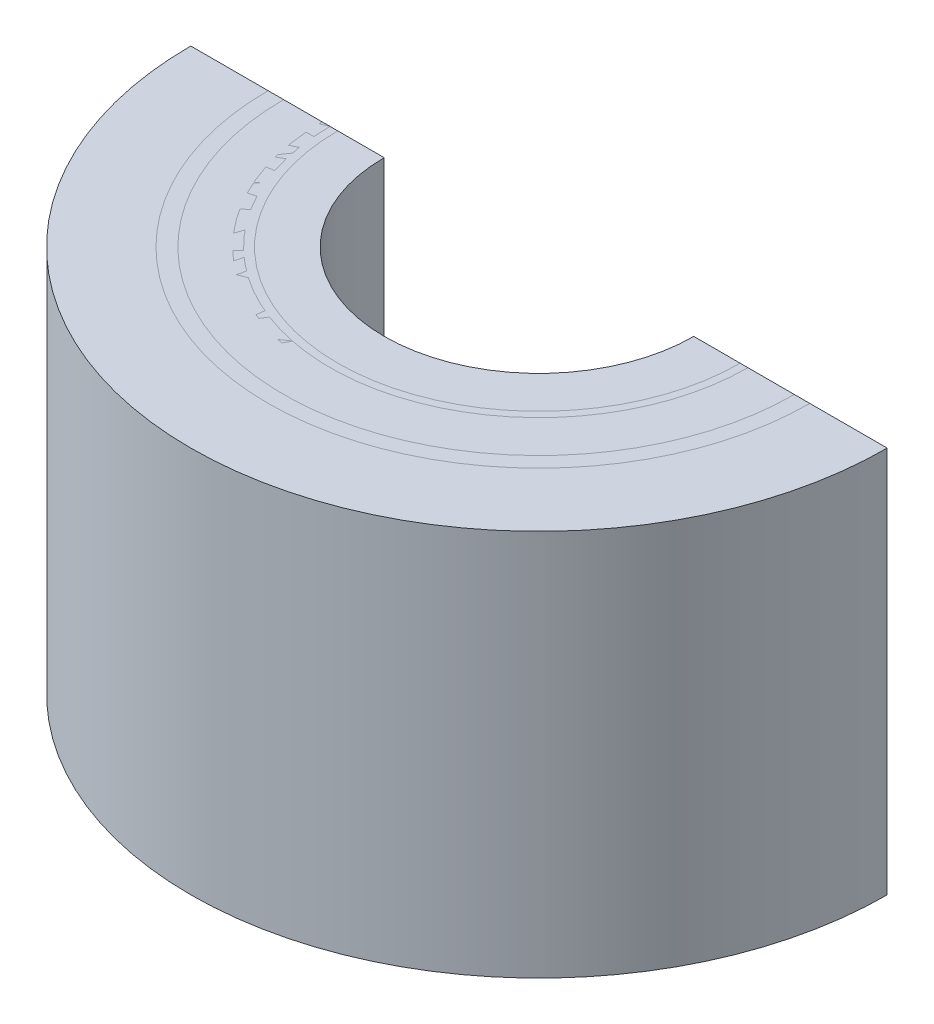
ISO-10303-21;
HEADER;
FILE_DESCRIPTION(('STEP AP214'),'2;1');
FILE_NAME('part.step','',(''),(''),'','','');
FILE_SCHEMA(('AUTOMOTIVE_DESIGN { 1 0 10303 214 1 1 1 1 }'));
ENDSEC;
DATA;
#1=APPLICATION_CONTEXT('core data for automotive mechanical design processes');
#2=APPLICATION_PROTOCOL_DEFINITION('international standard','automotive_design',2000,#1);
#3=PRODUCT_CONTEXT('',#1,'mechanical');
#4=PRODUCT('Part','Part','',(#3));
#5=PRODUCT_RELATED_PRODUCT_CATEGORY('part','',(#4));
#6=PRODUCT_DEFINITION_FORMATION('','',#4);
#7=PRODUCT_DEFINITION_CONTEXT('part definition',#1,'design');
#8=PRODUCT_DEFINITION('design','',#6,#7);
#9=PRODUCT_DEFINITION_SHAPE('','',#8);
#10=(LENGTH_UNIT() NAMED_UNIT(*) SI_UNIT(.MILLI.,.METRE.));
#11=(NAMED_UNIT(*) PLANE_ANGLE_UNIT() SI_UNIT($,.RADIAN.));
#12=(NAMED_UNIT(*) SI_UNIT($,.STERADIAN.) SOLID_ANGLE_UNIT());
#13=UNCERTAINTY_MEASURE_WITH_UNIT(LENGTH_MEASURE(1.E-05),#10,'distance_accuracy_value','');
#14=(GEOMETRIC_REPRESENTATION_CONTEXT(3) GLOBAL_UNCERTAINTY_ASSIGNED_CONTEXT((#13)) GLOBAL_UNIT_ASSIGNED_CONTEXT((#10,
#11,#12)) REPRESENTATION_CONTEXT('',''));
#15=CARTESIAN_POINT('',(0.,0.,0.));
#16=DIRECTION('',(0.,0.,1.));
#17=DIRECTION('',(1.,0.,0.));
#18=AXIS2_PLACEMENT_3D('',#15,#16,#17);
#19=CARTESIAN_POINT('',(-10.4075930728994,30.0600783028188,30.4966063293363));
#20=DIRECTION('',(0.,1.,0.));
#21=DIRECTION('',(0.,0.,1.));
#22=AXIS2_PLACEMENT_3D('',#19,#20,#21);
#23=PLANE('',#22);
#24=DIRECTION('',(1.,0.,0.));
#25=VECTOR('',#24,1.);
#26=CARTESIAN_POINT('',(-32.9075930728994,30.0600783028188,30.4966063293363));
#27=LINE('',#26,#25);
#28=CARTESIAN_POINT('',(-27.9075930728994,30.0600783028188,30.4966063293363));
#29=VERTEX_POINT('',#28);
#30=CARTESIAN_POINT('',(-26.9075930728994,30.0600783028188,30.4966063293363));
#31=VERTEX_POINT('',#30);
#32=EDGE_CURVE('E65',#29,#31,#27,.T.);
#33=ORIENTED_EDGE('',*,*,#32,.F.);
#34=CARTESIAN_POINT('',(-10.4075930728994,30.0600783028188,30.4966063293363));
#35=DIRECTION('',(0.,1.,0.));
#36=DIRECTION('',(0.,0.,1.));
#37=AXIS2_PLACEMENT_3D('',#34,#35,#36);
#38=CIRCLE('',#37,17.5);
#39=CARTESIAN_POINT('',(7.09240692710058,30.0600783028188,30.4966063293363));
#40=VERTEX_POINT('',#39);
#41=EDGE_CURVE('E95',#29,#40,#38,.T.);
#42=ORIENTED_EDGE('',*,*,#41,.T.);
#43=CARTESIAN_POINT('',(6.09240692710058,30.0600783028188,30.4966063293363));
#44=VERTEX_POINT('',#43);
#45=EDGE_CURVE('E98',#44,#40,#27,.T.);
#46=ORIENTED_EDGE('',*,*,#45,.F.);
#47=CARTESIAN_POINT('',(-10.4075930728994,30.0600783028188,30.4966063293363));
#48=DIRECTION('',(0.,1.,0.));
#49=DIRECTION('',(0.,0.,1.));
#50=AXIS2_PLACEMENT_3D('',#47,#48,#49);
#51=CIRCLE('',#50,16.5);
#52=EDGE_CURVE('E97',#31,#44,#51,.T.);
#53=ORIENTED_EDGE('',*,*,#52,.F.);
#54=EDGE_LOOP('',(#33,#42,#46,#53));
#55=FACE_BOUND('',#54,.T.);
#56=ADVANCED_FACE('F43',(#55),#23,.T.);
#57=CARTESIAN_POINT('',(-10.4075930728994,5.06007830281875,30.4966063293363));
#58=DIRECTION('',(0.,1.,0.));
#59=DIRECTION('',(0.,0.,1.));
#60=AXIS2_PLACEMENT_3D('',#57,#58,#59);
#61=PLANE('',#60);
#62=CARTESIAN_POINT('',(-10.4075930728994,5.06007830281875,30.4966063293363));
#63=DIRECTION('',(0.,1.,0.));
#64=DIRECTION('',(0.,0.,1.));
#65=AXIS2_PLACEMENT_3D('',#62,#63,#64);
#66=CIRCLE('',#65,17.5);
#67=CARTESIAN_POINT('',(-27.9075930728994,5.06007830281875,30.4966063293363));
#68=VERTEX_POINT('',#67);
#69=CARTESIAN_POINT('',(7.09240692710058,5.06007830281875,30.4966063293363));
#70=VERTEX_POINT('',#69);
#71=EDGE_CURVE('E102',#68,#70,#66,.T.);
#72=ORIENTED_EDGE('',*,*,#71,.F.);
#73=DIRECTION('',(1.,0.,0.));
#74=VECTOR('',#73,1.);
#75=CARTESIAN_POINT('',(-10.4075930728994,5.06007830281875,30.4966063293363));
#76=LINE('',#75,#74);
#77=CARTESIAN_POINT('',(-26.9075930728994,5.06007830281875,30.4966063293363));
#78=VERTEX_POINT('',#77);
#79=EDGE_CURVE('E84',#68,#78,#76,.T.);
#80=ORIENTED_EDGE('',*,*,#79,.T.);
#81=CARTESIAN_POINT('',(-10.4075930728994,5.06007830281875,30.4966063293363));
#82=DIRECTION('',(0.,1.,0.));
#83=DIRECTION('',(0.,0.,1.));
#84=AXIS2_PLACEMENT_3D('',#81,#82,#83);
#85=CIRCLE('',#84,16.5);
#86=CARTESIAN_POINT('',(6.09240692710058,5.06007830281875,30.4966063293363));
#87=VERTEX_POINT('',#86);
#88=EDGE_CURVE('E89',#78,#87,#85,.T.);
#89=ORIENTED_EDGE('',*,*,#88,.T.);
#90=EDGE_CURVE('E58',#87,#70,#76,.T.);
#91=ORIENTED_EDGE('',*,*,#90,.T.);
#92=EDGE_LOOP('',(#72,#80,#89,#91));
#93=FACE_BOUND('',#92,.T.);
#94=ADVANCED_FACE('F115',(#93),#61,.F.);
#95=CARTESIAN_POINT('',(-10.4075930728994,30.0600783028188,30.4966063293363));
#96=DIRECTION('',(0.,-1.,0.));
#97=DIRECTION('',(0.,0.,-1.));
#98=AXIS2_PLACEMENT_3D('',#95,#96,#97);
#99=CYLINDRICAL_SURFACE('',#98,17.5);
#100=ORIENTED_EDGE('',*,*,#41,.F.);
#101=DIRECTION('',(0.,-1.,0.));
#102=VECTOR('',#101,1.);
#103=CARTESIAN_POINT('',(-27.9075930728994,30.0600783028188,30.4966063293363));
#104=LINE('',#103,#102);
#105=EDGE_CURVE('E81',#29,#68,#104,.T.);
#106=ORIENTED_EDGE('',*,*,#105,.T.);
#107=ORIENTED_EDGE('',*,*,#71,.T.);
#108=DIRECTION('',(0.,-1.,0.));
#109=VECTOR('',#108,1.);
#110=CARTESIAN_POINT('',(7.09240692710058,30.0600783028188,30.4966063293363));
#111=LINE('',#110,#109);
#112=EDGE_CURVE('E101',#70,#40,#111,.F.);
#113=ORIENTED_EDGE('',*,*,#112,.T.);
#114=EDGE_LOOP('',(#100,#106,#107,#113));
#115=FACE_BOUND('',#114,.T.);
#116=ADVANCED_FACE('F45',(#115),#99,.T.);
#117=CARTESIAN_POINT('',(-10.4075930728994,30.0600783028188,30.4966063293363));
#118=DIRECTION('',(0.,-1.,0.));
#119=DIRECTION('',(0.,0.,-1.));
#120=AXIS2_PLACEMENT_3D('',#117,#118,#119);
#121=CYLINDRICAL_SURFACE('',#120,16.5);
#122=DIRECTION('',(0.,-1.,0.));
#123=VECTOR('',#122,1.);
#124=CARTESIAN_POINT('',(-26.9075930728994,30.0600783028188,30.4966063293363));
#125=LINE('',#124,#123);
#126=EDGE_CURVE('E12',#31,#78,#125,.T.);
#127=ORIENTED_EDGE('',*,*,#126,.F.);
#128=ORIENTED_EDGE('',*,*,#52,.T.);
#129=DIRECTION('',(0.,-1.,0.));
#130=VECTOR('',#129,1.);
#131=CARTESIAN_POINT('',(6.09240692710058,30.0600783028188,30.4966063293363));
#132=LINE('',#131,#130);
#133=EDGE_CURVE('E51',#87,#44,#132,.F.);
#134=ORIENTED_EDGE('',*,*,#133,.F.);
#135=ORIENTED_EDGE('',*,*,#88,.F.);
#136=EDGE_LOOP('',(#127,#128,#134,#135));
#137=FACE_BOUND('',#136,.T.);
#138=ADVANCED_FACE('F112',(#137),#121,.F.);
#139=CARTESIAN_POINT('',(-32.9075930728994,-5.93992169718125,30.4966063293363));
#140=DIRECTION('',(0.,0.,1.));
#141=DIRECTION('',(1.,0.,0.));
#142=AXIS2_PLACEMENT_3D('',#139,#140,#141);
#143=PLANE('',#142);
#144=ORIENTED_EDGE('',*,*,#90,.F.);
#145=ORIENTED_EDGE('',*,*,#133,.T.);
#146=ORIENTED_EDGE('',*,*,#45,.T.);
#147=ORIENTED_EDGE('',*,*,#112,.F.);
#148=EDGE_LOOP('',(#144,#145,#146,#147));
#149=FACE_BOUND('',#148,.T.);
#150=ADVANCED_FACE('F110',(#149),#143,.F.);
#151=ORIENTED_EDGE('',*,*,#32,.T.);
#152=ORIENTED_EDGE('',*,*,#126,.T.);
#153=ORIENTED_EDGE('',*,*,#79,.F.);
#154=ORIENTED_EDGE('',*,*,#105,.F.);
#155=EDGE_LOOP('',(#151,#152,#153,#154));
#156=FACE_BOUND('',#155,.T.);
#157=ADVANCED_FACE('F82',(#156),#143,.F.);
#158=CLOSED_SHELL('',(#56,#94,#116,#138,#150,#157));
#159=MANIFOLD_SOLID_BREP('B2',#158);
#160=CARTESIAN_POINT('',(-10.4075930728994,30.0600783028188,30.4966063293363));
#161=DIRECTION('',(0.,1.,0.));
#162=DIRECTION('',(0.,0.,1.));
#163=AXIS2_PLACEMENT_3D('',#160,#161,#162);
#164=PLANE('',#163);
#165=DIRECTION('',(1.,0.,0.));
#166=VECTOR('',#165,1.);
#167=CARTESIAN_POINT('',(-32.9075930728994,30.0600783028188,30.4966063293363));
#168=LINE('',#167,#166);
#169=CARTESIAN_POINT('',(-23.4075930728994,30.0600783028188,30.4966063293363));
#170=VERTEX_POINT('',#169);
#171=CARTESIAN_POINT('',(-20.4075930728994,30.0600783028188,30.4966063293363));
#172=VERTEX_POINT('',#171);
#173=EDGE_CURVE('E195',#170,#172,#168,.T.);
#174=ORIENTED_EDGE('',*,*,#173,.F.);
#175=CARTESIAN_POINT('',(-10.4075930728994,30.0600783028188,30.4966063293363));
#176=DIRECTION('',(0.,1.,0.));
#177=DIRECTION('',(0.,0.,1.));
#178=AXIS2_PLACEMENT_3D('',#175,#176,#177);
#179=CIRCLE('',#178,13.);
#180=CARTESIAN_POINT('',(2.59240692710058,30.0600783028188,30.4966063293363));
#181=VERTEX_POINT('',#180);
#182=EDGE_CURVE('E225',#170,#181,#179,.T.);
#183=ORIENTED_EDGE('',*,*,#182,.T.);
#184=CARTESIAN_POINT('',(-0.407593072899424,30.0600783028188,30.4966063293363));
#185=VERTEX_POINT('',#184);
#186=EDGE_CURVE('E228',#185,#181,#168,.T.);
#187=ORIENTED_EDGE('',*,*,#186,.F.);
#188=CARTESIAN_POINT('',(-10.4075930728994,30.0600783028188,30.4966063293363));
#189=DIRECTION('',(0.,1.,0.));
#190=DIRECTION('',(0.,0.,1.));
#191=AXIS2_PLACEMENT_3D('',#188,#189,#190);
#192=CIRCLE('',#191,10.);
#193=EDGE_CURVE('E227',#172,#185,#192,.T.);
#194=ORIENTED_EDGE('',*,*,#193,.F.);
#195=EDGE_LOOP('',(#174,#183,#187,#194));
#196=FACE_BOUND('',#195,.T.);
#197=ADVANCED_FACE('F173',(#196),#164,.T.);
#198=CARTESIAN_POINT('',(-10.4075930728994,5.06007830281875,30.4966063293363));
#199=DIRECTION('',(0.,1.,0.));
#200=DIRECTION('',(0.,0.,1.));
#201=AXIS2_PLACEMENT_3D('',#198,#199,#200);
#202=PLANE('',#201);
#203=CARTESIAN_POINT('',(-10.4075930728994,5.06007830281875,30.4966063293363));
#204=DIRECTION('',(0.,1.,0.));
#205=DIRECTION('',(0.,0.,1.));
#206=AXIS2_PLACEMENT_3D('',#203,#204,#205);
#207=CIRCLE('',#206,13.);
#208=CARTESIAN_POINT('',(-23.4075930728994,5.06007830281875,30.4966063293363));
#209=VERTEX_POINT('',#208);
#210=CARTESIAN_POINT('',(2.59240692710058,5.06007830281875,30.4966063293363));
#211=VERTEX_POINT('',#210);
#212=EDGE_CURVE('E232',#209,#211,#207,.T.);
#213=ORIENTED_EDGE('',*,*,#212,.F.);
#214=DIRECTION('',(1.,0.,0.));
#215=VECTOR('',#214,1.);
#216=CARTESIAN_POINT('',(-10.4075930728994,5.06007830281875,30.4966063293363));
#217=LINE('',#216,#215);
#218=CARTESIAN_POINT('',(-20.4075930728994,5.06007830281875,30.4966063293363));
#219=VERTEX_POINT('',#218);
#220=EDGE_CURVE('E214',#209,#219,#217,.T.);
#221=ORIENTED_EDGE('',*,*,#220,.T.);
#222=CARTESIAN_POINT('',(-10.4075930728994,5.06007830281875,30.4966063293363));
#223=DIRECTION('',(0.,1.,0.));
#224=DIRECTION('',(0.,0.,1.));
#225=AXIS2_PLACEMENT_3D('',#222,#223,#224);
#226=CIRCLE('',#225,10.);
#227=CARTESIAN_POINT('',(-0.407593072899424,5.06007830281875,30.4966063293363));
#228=VERTEX_POINT('',#227);
#229=EDGE_CURVE('E219',#219,#228,#226,.T.);
#230=ORIENTED_EDGE('',*,*,#229,.T.);
#231=EDGE_CURVE('E188',#228,#211,#217,.T.);
#232=ORIENTED_EDGE('',*,*,#231,.T.);
#233=EDGE_LOOP('',(#213,#221,#230,#232));
#234=FACE_BOUND('',#233,.T.);
#235=ADVANCED_FACE('F245',(#234),#202,.F.);
#236=CARTESIAN_POINT('',(-10.4075930728994,30.0600783028188,30.4966063293363));
#237=DIRECTION('',(0.,-1.,0.));
#238=DIRECTION('',(0.,0.,-1.));
#239=AXIS2_PLACEMENT_3D('',#236,#237,#238);
#240=CYLINDRICAL_SURFACE('',#239,13.);
#241=ORIENTED_EDGE('',*,*,#182,.F.);
#242=DIRECTION('',(0.,-1.,0.));
#243=VECTOR('',#242,1.);
#244=CARTESIAN_POINT('',(-23.4075930728994,30.0600783028188,30.4966063293363));
#245=LINE('',#244,#243);
#246=EDGE_CURVE('E211',#170,#209,#245,.T.);
#247=ORIENTED_EDGE('',*,*,#246,.T.);
#248=ORIENTED_EDGE('',*,*,#212,.T.);
#249=DIRECTION('',(0.,-1.,0.));
#250=VECTOR('',#249,1.);
#251=CARTESIAN_POINT('',(2.59240692710058,30.0600783028188,30.4966063293363));
#252=LINE('',#251,#250);
#253=EDGE_CURVE('E231',#211,#181,#252,.F.);
#254=ORIENTED_EDGE('',*,*,#253,.T.);
#255=EDGE_LOOP('',(#241,#247,#248,#254));
#256=FACE_BOUND('',#255,.T.);
#257=ADVANCED_FACE('F175',(#256),#240,.T.);
#258=CARTESIAN_POINT('',(-10.4075930728994,30.0600783028188,30.4966063293363));
#259=DIRECTION('',(0.,-1.,0.));
#260=DIRECTION('',(0.,0.,-1.));
#261=AXIS2_PLACEMENT_3D('',#258,#259,#260);
#262=CYLINDRICAL_SURFACE('',#261,10.);
#263=DIRECTION('',(0.,-1.,0.));
#264=VECTOR('',#263,1.);
#265=CARTESIAN_POINT('',(-20.4075930728994,30.0600783028188,30.4966063293363));
#266=LINE('',#265,#264);
#267=EDGE_CURVE('E41',#172,#219,#266,.T.);
#268=ORIENTED_EDGE('',*,*,#267,.F.);
#269=ORIENTED_EDGE('',*,*,#193,.T.);
#270=DIRECTION('',(0.,-1.,0.));
#271=VECTOR('',#270,1.);
#272=CARTESIAN_POINT('',(-0.407593072899424,30.0600783028188,30.4966063293363));
#273=LINE('',#272,#271);
#274=EDGE_CURVE('E181',#228,#185,#273,.F.);
#275=ORIENTED_EDGE('',*,*,#274,.F.);
#276=ORIENTED_EDGE('',*,*,#229,.F.);
#277=EDGE_LOOP('',(#268,#269,#275,#276));
#278=FACE_BOUND('',#277,.T.);
#279=ADVANCED_FACE('F242',(#278),#262,.F.);
#280=CARTESIAN_POINT('',(-32.9075930728994,-5.93992169718125,30.4966063293363));
#281=DIRECTION('',(0.,0.,1.));
#282=DIRECTION('',(1.,0.,0.));
#283=AXIS2_PLACEMENT_3D('',#280,#281,#282);
#284=PLANE('',#283);
#285=ORIENTED_EDGE('',*,*,#231,.F.);
#286=ORIENTED_EDGE('',*,*,#274,.T.);
#287=ORIENTED_EDGE('',*,*,#186,.T.);
#288=ORIENTED_EDGE('',*,*,#253,.F.);
#289=EDGE_LOOP('',(#285,#286,#287,#288));
#290=FACE_BOUND('',#289,.T.);
#291=ADVANCED_FACE('F240',(#290),#284,.F.);
#292=ORIENTED_EDGE('',*,*,#173,.T.);
#293=ORIENTED_EDGE('',*,*,#267,.T.);
#294=ORIENTED_EDGE('',*,*,#220,.F.);
#295=ORIENTED_EDGE('',*,*,#246,.F.);
#296=EDGE_LOOP('',(#292,#293,#294,#295));
#297=FACE_BOUND('',#296,.T.);
#298=ADVANCED_FACE('F212',(#297),#284,.F.);
#299=CLOSED_SHELL('',(#197,#235,#257,#279,#291,#298));
#300=MANIFOLD_SOLID_BREP('B6',#299);
#301=CARTESIAN_POINT('',(-10.4075930728994,30.0600783028188,30.4966063293363));
#302=DIRECTION('',(0.,1.,0.));
#303=DIRECTION('',(0.,0.,1.));
#304=AXIS2_PLACEMENT_3D('',#301,#302,#303);
#305=PLANE('',#304);
#306=DIRECTION('',(1.,0.,0.));
#307=VECTOR('',#306,1.);
#308=CARTESIAN_POINT('',(-32.9075930728994,30.0600783028188,30.4966063293363));
#309=LINE('',#308,#307);
#310=CARTESIAN_POINT('',(-26.9075930728994,30.0600783028188,30.4966063293363));
#311=VERTEX_POINT('',#310);
#312=CARTESIAN_POINT('',(-23.9075930728994,30.0600783028188,30.4966063293363));
#313=VERTEX_POINT('',#312);
#314=EDGE_CURVE('E325',#311,#313,#309,.T.);
#315=ORIENTED_EDGE('',*,*,#314,.F.);
#316=CARTESIAN_POINT('',(-10.4075930728994,30.0600783028188,30.4966063293363));
#317=DIRECTION('',(0.,1.,0.));
#318=DIRECTION('',(0.,0.,1.));
#319=AXIS2_PLACEMENT_3D('',#316,#317,#318);
#320=CIRCLE('',#319,16.5);
#321=CARTESIAN_POINT('',(6.09240692710058,30.0600783028188,30.4966063293363));
#322=VERTEX_POINT('',#321);
#323=EDGE_CURVE('E355',#311,#322,#320,.T.);
#324=ORIENTED_EDGE('',*,*,#323,.T.);
#325=CARTESIAN_POINT('',(3.09240692710058,30.0600783028188,30.4966063293363));
#326=VERTEX_POINT('',#325);
#327=EDGE_CURVE('E358',#326,#322,#309,.T.);
#328=ORIENTED_EDGE('',*,*,#327,.F.);
#329=CARTESIAN_POINT('',(-10.4075930728994,30.0600783028188,30.4966063293363));
#330=DIRECTION('',(0.,1.,0.));
#331=DIRECTION('',(0.,0.,1.));
#332=AXIS2_PLACEMENT_3D('',#329,#330,#331);
#333=CIRCLE('',#332,13.5);
#334=EDGE_CURVE('E357',#313,#326,#333,.T.);
#335=ORIENTED_EDGE('',*,*,#334,.F.);
#336=EDGE_LOOP('',(#315,#324,#328,#335));
#337=FACE_BOUND('',#336,.T.);
#338=ADVANCED_FACE('F303',(#337),#305,.T.);
#339=CARTESIAN_POINT('',(-10.4075930728994,5.06007830281875,30.4966063293363));
#340=DIRECTION('',(0.,1.,0.));
#341=DIRECTION('',(0.,0.,1.));
#342=AXIS2_PLACEMENT_3D('',#339,#340,#341);
#343=PLANE('',#342);
#344=CARTESIAN_POINT('',(-10.4075930728994,5.06007830281875,30.4966063293363));
#345=DIRECTION('',(0.,1.,0.));
#346=DIRECTION('',(0.,0.,1.));
#347=AXIS2_PLACEMENT_3D('',#344,#345,#346);
#348=CIRCLE('',#347,16.5);
#349=CARTESIAN_POINT('',(-26.9075930728994,5.06007830281875,30.4966063293363));
#350=VERTEX_POINT('',#349);
#351=CARTESIAN_POINT('',(6.09240692710058,5.06007830281875,30.4966063293363));
#352=VERTEX_POINT('',#351);
#353=EDGE_CURVE('E362',#350,#352,#348,.T.);
#354=ORIENTED_EDGE('',*,*,#353,.F.);
#355=DIRECTION('',(1.,0.,0.));
#356=VECTOR('',#355,1.);
#357=CARTESIAN_POINT('',(-10.4075930728994,5.06007830281875,30.4966063293363));
#358=LINE('',#357,#356);
#359=CARTESIAN_POINT('',(-23.9075930728994,5.06007830281875,30.4966063293363));
#360=VERTEX_POINT('',#359);
#361=EDGE_CURVE('E344',#350,#360,#358,.T.);
#362=ORIENTED_EDGE('',*,*,#361,.T.);
#363=CARTESIAN_POINT('',(-10.4075930728994,5.06007830281875,30.4966063293363));
#364=DIRECTION('',(0.,1.,0.));
#365=DIRECTION('',(0.,0.,1.));
#366=AXIS2_PLACEMENT_3D('',#363,#364,#365);
#367=CIRCLE('',#366,13.5);
#368=CARTESIAN_POINT('',(3.09240692710058,5.06007830281875,30.4966063293363));
#369=VERTEX_POINT('',#368);
#370=EDGE_CURVE('E349',#360,#369,#367,.T.);
#371=ORIENTED_EDGE('',*,*,#370,.T.);
#372=EDGE_CURVE('E318',#369,#352,#358,.T.);
#373=ORIENTED_EDGE('',*,*,#372,.T.);
#374=EDGE_LOOP('',(#354,#362,#371,#373));
#375=FACE_BOUND('',#374,.T.);
#376=ADVANCED_FACE('F375',(#375),#343,.F.);
#377=CARTESIAN_POINT('',(-10.4075930728994,30.0600783028188,30.4966063293363));
#378=DIRECTION('',(0.,-1.,0.));
#379=DIRECTION('',(0.,0.,-1.));
#380=AXIS2_PLACEMENT_3D('',#377,#378,#379);
#381=CYLINDRICAL_SURFACE('',#380,16.5);
#382=ORIENTED_EDGE('',*,*,#323,.F.);
#383=DIRECTION('',(0.,-1.,0.));
#384=VECTOR('',#383,1.);
#385=CARTESIAN_POINT('',(-26.9075930728994,30.0600783028188,30.4966063293363));
#386=LINE('',#385,#384);
#387=EDGE_CURVE('E341',#311,#350,#386,.T.);
#388=ORIENTED_EDGE('',*,*,#387,.T.);
#389=ORIENTED_EDGE('',*,*,#353,.T.);
#390=DIRECTION('',(0.,-1.,0.));
#391=VECTOR('',#390,1.);
#392=CARTESIAN_POINT('',(6.09240692710058,30.0600783028188,30.4966063293363));
#393=LINE('',#392,#391);
#394=EDGE_CURVE('E361',#352,#322,#393,.F.);
#395=ORIENTED_EDGE('',*,*,#394,.T.);
#396=EDGE_LOOP('',(#382,#388,#389,#395));
#397=FACE_BOUND('',#396,.T.);
#398=ADVANCED_FACE('F305',(#397),#381,.T.);
#399=CARTESIAN_POINT('',(-10.4075930728994,30.0600783028188,30.4966063293363));
#400=DIRECTION('',(0.,-1.,0.));
#401=DIRECTION('',(0.,0.,-1.));
#402=AXIS2_PLACEMENT_3D('',#399,#400,#401);
#403=CYLINDRICAL_SURFACE('',#402,13.5);
#404=DIRECTION('',(0.,-1.,0.));
#405=VECTOR('',#404,1.);
#406=CARTESIAN_POINT('',(-23.9075930728994,30.0600783028188,30.4966063293363));
#407=LINE('',#406,#405);
#408=EDGE_CURVE('E171',#313,#360,#407,.T.);
#409=ORIENTED_EDGE('',*,*,#408,.F.);
#410=ORIENTED_EDGE('',*,*,#334,.T.);
#411=DIRECTION('',(0.,-1.,0.));
#412=VECTOR('',#411,1.);
#413=CARTESIAN_POINT('',(3.09240692710058,30.0600783028188,30.4966063293363));
#414=LINE('',#413,#412);
#415=EDGE_CURVE('E311',#369,#326,#414,.F.);
#416=ORIENTED_EDGE('',*,*,#415,.F.);
#417=ORIENTED_EDGE('',*,*,#370,.F.);
#418=EDGE_LOOP('',(#409,#410,#416,#417));
#419=FACE_BOUND('',#418,.T.);
#420=ADVANCED_FACE('F372',(#419),#403,.F.);
#421=CARTESIAN_POINT('',(-32.9075930728994,-5.93992169718125,30.4966063293363));
#422=DIRECTION('',(0.,0.,1.));
#423=DIRECTION('',(1.,0.,0.));
#424=AXIS2_PLACEMENT_3D('',#421,#422,#423);
#425=PLANE('',#424);
#426=ORIENTED_EDGE('',*,*,#372,.F.);
#427=ORIENTED_EDGE('',*,*,#415,.T.);
#428=ORIENTED_EDGE('',*,*,#327,.T.);
#429=ORIENTED_EDGE('',*,*,#394,.F.);
#430=EDGE_LOOP('',(#426,#427,#428,#429));
#431=FACE_BOUND('',#430,.T.);
#432=ADVANCED_FACE('F370',(#431),#425,.F.);
#433=ORIENTED_EDGE('',*,*,#314,.T.);
#434=ORIENTED_EDGE('',*,*,#408,.T.);
#435=ORIENTED_EDGE('',*,*,#361,.F.);
#436=ORIENTED_EDGE('',*,*,#387,.F.);
#437=EDGE_LOOP('',(#433,#434,#435,#436));
#438=FACE_BOUND('',#437,.T.);
#439=ADVANCED_FACE('F342',(#438),#425,.F.);
#440=CLOSED_SHELL('',(#338,#376,#398,#420,#432,#439));
#441=MANIFOLD_SOLID_BREP('B35',#440);
#442=CARTESIAN_POINT('',(-10.4075930728994,30.0600783028188,30.4966063293363));
#443=DIRECTION('',(0.,1.,0.));
#444=DIRECTION('',(0.,0.,1.));
#445=AXIS2_PLACEMENT_3D('',#442,#443,#444);
#446=PLANE('',#445);
#447=DIRECTION('',(1.,0.,0.));
#448=VECTOR('',#447,1.);
#449=CARTESIAN_POINT('',(-32.9075930728994,30.0600783028188,30.4966063293363));
#450=LINE('',#449,#448);
#451=CARTESIAN_POINT('',(-24.4075930728994,30.0600783028188,30.4966063293363));
#452=VERTEX_POINT('',#451);
#453=CARTESIAN_POINT('',(-23.4075930728994,30.0600783028188,30.4966063293363));
#454=VERTEX_POINT('',#453);
#455=EDGE_CURVE('E454',#452,#454,#450,.T.);
#456=ORIENTED_EDGE('',*,*,#455,.F.);
#457=CARTESIAN_POINT('',(-10.4075930728994,30.0600783028188,30.4966063293363));
#458=DIRECTION('',(0.,1.,0.));
#459=DIRECTION('',(0.,0.,1.));
#460=AXIS2_PLACEMENT_3D('',#457,#458,#459);
#461=CIRCLE('',#460,14.);
#462=CARTESIAN_POINT('',(3.59240692710058,30.0600783028188,30.4966063293363));
#463=VERTEX_POINT('',#462);
#464=EDGE_CURVE('E484',#452,#463,#461,.T.);
#465=ORIENTED_EDGE('',*,*,#464,.T.);
#466=CARTESIAN_POINT('',(2.59240692710058,30.0600783028188,30.4966063293363));
#467=VERTEX_POINT('',#466);
#468=EDGE_CURVE('E487',#467,#463,#450,.T.);
#469=ORIENTED_EDGE('',*,*,#468,.F.);
#470=CARTESIAN_POINT('',(-10.4075930728994,30.0600783028188,30.4966063293363));
#471=DIRECTION('',(0.,1.,0.));
#472=DIRECTION('',(0.,0.,1.));
#473=AXIS2_PLACEMENT_3D('',#470,#471,#472);
#474=CIRCLE('',#473,13.);
#475=EDGE_CURVE('E486',#454,#467,#474,.T.);
#476=ORIENTED_EDGE('',*,*,#475,.F.);
#477=EDGE_LOOP('',(#456,#465,#469,#476));
#478=FACE_BOUND('',#477,.T.);
#479=ADVANCED_FACE('F432',(#478),#446,.T.);
#480=CARTESIAN_POINT('',(-10.4075930728994,5.06007830281875,30.4966063293363));
#481=DIRECTION('',(0.,1.,0.));
#482=DIRECTION('',(0.,0.,1.));
#483=AXIS2_PLACEMENT_3D('',#480,#481,#482);
#484=PLANE('',#483);
#485=CARTESIAN_POINT('',(-10.4075930728994,5.06007830281875,30.4966063293363));
#486=DIRECTION('',(0.,1.,0.));
#487=DIRECTION('',(0.,0.,1.));
#488=AXIS2_PLACEMENT_3D('',#485,#486,#487);
#489=CIRCLE('',#488,14.);
#490=CARTESIAN_POINT('',(-24.4075930728994,5.06007830281875,30.4966063293363));
#491=VERTEX_POINT('',#490);
#492=CARTESIAN_POINT('',(3.59240692710058,5.06007830281875,30.4966063293363));
#493=VERTEX_POINT('',#492);
#494=EDGE_CURVE('E491',#491,#493,#489,.T.);
#495=ORIENTED_EDGE('',*,*,#494,.F.);
#496=DIRECTION('',(1.,0.,0.));
#497=VECTOR('',#496,1.);
#498=CARTESIAN_POINT('',(-10.4075930728994,5.06007830281875,30.4966063293363));
#499=LINE('',#498,#497);
#500=CARTESIAN_POINT('',(-23.4075930728994,5.06007830281875,30.4966063293363));
#501=VERTEX_POINT('',#500);
#502=EDGE_CURVE('E473',#491,#501,#499,.T.);
#503=ORIENTED_EDGE('',*,*,#502,.T.);
#504=CARTESIAN_POINT('',(-10.4075930728994,5.06007830281875,30.4966063293363));
#505=DIRECTION('',(0.,1.,0.));
#506=DIRECTION('',(0.,0.,1.));
#507=AXIS2_PLACEMENT_3D('',#504,#505,#506);
#508=CIRCLE('',#507,13.);
#509=CARTESIAN_POINT('',(2.59240692710058,5.06007830281875,30.4966063293363));
#510=VERTEX_POINT('',#509);
#511=EDGE_CURVE('E478',#501,#510,#508,.T.);
#512=ORIENTED_EDGE('',*,*,#511,.T.);
#513=EDGE_CURVE('E447',#510,#493,#499,.T.);
#514=ORIENTED_EDGE('',*,*,#513,.T.);
#515=EDGE_LOOP('',(#495,#503,#512,#514));
#516=FACE_BOUND('',#515,.T.);
#517=ADVANCED_FACE('F504',(#516),#484,.F.);
#518=CARTESIAN_POINT('',(-10.4075930728994,30.0600783028188,30.4966063293363));
#519=DIRECTION('',(0.,-1.,0.));
#520=DIRECTION('',(0.,0.,-1.));
#521=AXIS2_PLACEMENT_3D('',#518,#519,#520);
#522=CYLINDRICAL_SURFACE('',#521,14.);
#523=ORIENTED_EDGE('',*,*,#464,.F.);
#524=DIRECTION('',(0.,-1.,0.));
#525=VECTOR('',#524,1.);
#526=CARTESIAN_POINT('',(-24.4075930728994,30.0600783028188,30.4966063293363));
#527=LINE('',#526,#525);
#528=EDGE_CURVE('E470',#452,#491,#527,.T.);
#529=ORIENTED_EDGE('',*,*,#528,.T.);
#530=ORIENTED_EDGE('',*,*,#494,.T.);
#531=DIRECTION('',(0.,-1.,0.));
#532=VECTOR('',#531,1.);
#533=CARTESIAN_POINT('',(3.59240692710058,30.0600783028188,30.4966063293363));
#534=LINE('',#533,#532);
#535=EDGE_CURVE('E490',#493,#463,#534,.F.);
#536=ORIENTED_EDGE('',*,*,#535,.T.);
#537=EDGE_LOOP('',(#523,#529,#530,#536));
#538=FACE_BOUND('',#537,.T.);
#539=ADVANCED_FACE('F434',(#538),#522,.T.);
#540=CARTESIAN_POINT('',(-10.4075930728994,30.0600783028188,30.4966063293363));
#541=DIRECTION('',(0.,-1.,0.));
#542=DIRECTION('',(0.,0.,-1.));
#543=AXIS2_PLACEMENT_3D('',#540,#541,#542);
#544=CYLINDRICAL_SURFACE('',#543,13.);
#545=DIRECTION('',(0.,-1.,0.));
#546=VECTOR('',#545,1.);
#547=CARTESIAN_POINT('',(-23.4075930728994,30.0600783028188,30.4966063293363));
#548=LINE('',#547,#546);
#549=EDGE_CURVE('E301',#454,#501,#548,.T.);
#550=ORIENTED_EDGE('',*,*,#549,.F.);
#551=ORIENTED_EDGE('',*,*,#475,.T.);
#552=DIRECTION('',(0.,-1.,0.));
#553=VECTOR('',#552,1.);
#554=CARTESIAN_POINT('',(2.59240692710058,30.0600783028188,30.4966063293363));
#555=LINE('',#554,#553);
#556=EDGE_CURVE('E440',#510,#467,#555,.F.);
#557=ORIENTED_EDGE('',*,*,#556,.F.);
#558=ORIENTED_EDGE('',*,*,#511,.F.);
#559=EDGE_LOOP('',(#550,#551,#557,#558));
#560=FACE_BOUND('',#559,.T.);
#561=ADVANCED_FACE('F501',(#560),#544,.F.);
#562=CARTESIAN_POINT('',(-32.9075930728994,-5.93992169718125,30.4966063293363));
#563=DIRECTION('',(0.,0.,1.));
#564=DIRECTION('',(1.,0.,0.));
#565=AXIS2_PLACEMENT_3D('',#562,#563,#564);
#566=PLANE('',#565);
#567=ORIENTED_EDGE('',*,*,#513,.F.);
#568=ORIENTED_EDGE('',*,*,#556,.T.);
#569=ORIENTED_EDGE('',*,*,#468,.T.);
#570=ORIENTED_EDGE('',*,*,#535,.F.);
#571=EDGE_LOOP('',(#567,#568,#569,#570));
#572=FACE_BOUND('',#571,.T.);
#573=ADVANCED_FACE('F499',(#572),#566,.F.);
#574=ORIENTED_EDGE('',*,*,#455,.T.);
#575=ORIENTED_EDGE('',*,*,#549,.T.);
#576=ORIENTED_EDGE('',*,*,#502,.F.);
#577=ORIENTED_EDGE('',*,*,#528,.F.);
#578=EDGE_LOOP('',(#574,#575,#576,#577));
#579=FACE_BOUND('',#578,.T.);
#580=ADVANCED_FACE('F471',(#579),#566,.F.);
#581=CLOSED_SHELL('',(#479,#517,#539,#561,#573,#580));
#582=MANIFOLD_SOLID_BREP('B165',#581);
#583=CARTESIAN_POINT('',(-10.4075930728994,30.0600783028188,30.4966063293363));
#584=DIRECTION('',(0.,1.,0.));
#585=DIRECTION('',(0.,0.,1.));
#586=AXIS2_PLACEMENT_3D('',#583,#584,#585);
#587=PLANE('',#586);
#588=DIRECTION('',(1.,0.,0.));
#589=VECTOR('',#588,1.);
#590=CARTESIAN_POINT('',(-32.9075930728994,30.0600783028188,30.4966063293363));
#591=LINE('',#590,#589);
#592=CARTESIAN_POINT('',(-32.9075930728994,30.0600783028188,30.4966063293363));
#593=VERTEX_POINT('',#592);
#594=CARTESIAN_POINT('',(-27.9075930728994,30.0600783028188,30.4966063293363));
#595=VERTEX_POINT('',#594);
#596=EDGE_CURVE('E574',#593,#595,#591,.T.);
#597=ORIENTED_EDGE('',*,*,#596,.F.);
#598=CARTESIAN_POINT('',(-10.4075930728994,30.0600783028188,30.4966063293363));
#599=DIRECTION('',(0.,1.,0.));
#600=DIRECTION('',(0.,0.,1.));
#601=AXIS2_PLACEMENT_3D('',#598,#599,#600);
#602=CIRCLE('',#601,22.5);
#603=CARTESIAN_POINT('',(12.0924069271006,30.0600783028188,30.4966063293363));
#604=VERTEX_POINT('',#603);
#605=EDGE_CURVE('E603',#593,#604,#602,.T.);
#606=ORIENTED_EDGE('',*,*,#605,.T.);
#607=CARTESIAN_POINT('',(7.09240692710058,30.0600783028188,30.4966063293363));
#608=VERTEX_POINT('',#607);
#609=EDGE_CURVE('E606',#608,#604,#591,.T.);
#610=ORIENTED_EDGE('',*,*,#609,.F.);
#611=CARTESIAN_POINT('',(-10.4075930728994,30.0600783028188,30.4966063293363));
#612=DIRECTION('',(0.,1.,0.));
#613=DIRECTION('',(0.,0.,1.));
#614=AXIS2_PLACEMENT_3D('',#611,#612,#613);
#615=CIRCLE('',#614,17.5);
#616=EDGE_CURVE('E605',#595,#608,#615,.T.);
#617=ORIENTED_EDGE('',*,*,#616,.F.);
#618=EDGE_LOOP('',(#597,#606,#610,#617));
#619=FACE_BOUND('',#618,.T.);
#620=ADVANCED_FACE('F552',(#619),#587,.T.);
#621=CARTESIAN_POINT('',(-10.4075930728994,5.06007830281876,30.4966063293363));
#622=DIRECTION('',(0.,1.,0.));
#623=DIRECTION('',(0.,0.,1.));
#624=AXIS2_PLACEMENT_3D('',#621,#622,#623);
#625=PLANE('',#624);
#626=CARTESIAN_POINT('',(-10.4075930728994,5.06007830281876,30.4966063293363));
#627=DIRECTION('',(0.,1.,0.));
#628=DIRECTION('',(0.,0.,1.));
#629=AXIS2_PLACEMENT_3D('',#626,#627,#628);
#630=CIRCLE('',#629,22.5);
#631=CARTESIAN_POINT('',(-32.9075930728994,5.06007830281876,30.4966063293363));
#632=VERTEX_POINT('',#631);
#633=CARTESIAN_POINT('',(12.0924069271006,5.06007830281876,30.4966063293363));
#634=VERTEX_POINT('',#633);
#635=EDGE_CURVE('E610',#632,#634,#630,.T.);
#636=ORIENTED_EDGE('',*,*,#635,.F.);
#637=DIRECTION('',(1.,0.,0.));
#638=VECTOR('',#637,1.);
#639=CARTESIAN_POINT('',(-10.4075930728994,5.06007830281876,30.4966063293363));
#640=LINE('',#639,#638);
#641=CARTESIAN_POINT('',(-27.9075930728994,5.06007830281876,30.4966063293363));
#642=VERTEX_POINT('',#641);
#643=EDGE_CURVE('E593',#632,#642,#640,.T.);
#644=ORIENTED_EDGE('',*,*,#643,.T.);
#645=CARTESIAN_POINT('',(-10.4075930728994,5.06007830281876,30.4966063293363));
#646=DIRECTION('',(0.,1.,0.));
#647=DIRECTION('',(0.,0.,1.));
#648=AXIS2_PLACEMENT_3D('',#645,#646,#647);
#649=CIRCLE('',#648,17.5);
#650=CARTESIAN_POINT('',(7.09240692710058,5.06007830281876,30.4966063293363));
#651=VERTEX_POINT('',#650);
#652=EDGE_CURVE('E614',#642,#651,#649,.T.);
#653=ORIENTED_EDGE('',*,*,#652,.T.);
#654=EDGE_CURVE('E567',#651,#634,#640,.T.);
#655=ORIENTED_EDGE('',*,*,#654,.T.);
#656=EDGE_LOOP('',(#636,#644,#653,#655));
#657=FACE_BOUND('',#656,.T.);
#658=ADVANCED_FACE('F621',(#657),#625,.F.);
#659=CARTESIAN_POINT('',(-10.4075930728994,30.0600783028188,30.4966063293363));
#660=DIRECTION('',(0.,-1.,0.));
#661=DIRECTION('',(0.,0.,-1.));
#662=AXIS2_PLACEMENT_3D('',#659,#660,#661);
#663=CYLINDRICAL_SURFACE('',#662,22.5);
#664=ORIENTED_EDGE('',*,*,#605,.F.);
#665=DIRECTION('',(0.,1.,0.));
#666=VECTOR('',#665,1.);
#667=CARTESIAN_POINT('',(-32.9075930728994,-5.93992169718125,30.4966063293363));
#668=LINE('',#667,#666);
#669=EDGE_CURVE('E590',#632,#593,#668,.T.);
#670=ORIENTED_EDGE('',*,*,#669,.F.);
#671=ORIENTED_EDGE('',*,*,#635,.T.);
#672=DIRECTION('',(0.,-1.,0.));
#673=VECTOR('',#672,1.);
#674=CARTESIAN_POINT('',(12.0924069271006,30.0600783028188,30.4966063293363));
#675=LINE('',#674,#673);
#676=EDGE_CURVE('E609',#634,#604,#675,.F.);
#677=ORIENTED_EDGE('',*,*,#676,.T.);
#678=EDGE_LOOP('',(#664,#670,#671,#677));
#679=FACE_BOUND('',#678,.T.);
#680=ADVANCED_FACE('F554',(#679),#663,.T.);
#681=CARTESIAN_POINT('',(-10.4075930728994,30.0600783028188,30.4966063293363));
#682=DIRECTION('',(0.,-1.,0.));
#683=DIRECTION('',(0.,0.,-1.));
#684=AXIS2_PLACEMENT_3D('',#681,#682,#683);
#685=CYLINDRICAL_SURFACE('',#684,17.5);
#686=DIRECTION('',(0.,-1.,0.));
#687=VECTOR('',#686,1.);
#688=CARTESIAN_POINT('',(-27.9075930728994,30.0600783028188,30.4966063293363));
#689=LINE('',#688,#687);
#690=EDGE_CURVE('E430',#595,#642,#689,.T.);
#691=ORIENTED_EDGE('',*,*,#690,.F.);
#692=ORIENTED_EDGE('',*,*,#616,.T.);
#693=DIRECTION('',(0.,-1.,0.));
#694=VECTOR('',#693,1.);
#695=CARTESIAN_POINT('',(7.09240692710058,30.0600783028188,30.4966063293363));
#696=LINE('',#695,#694);
#697=EDGE_CURVE('E560',#651,#608,#696,.F.);
#698=ORIENTED_EDGE('',*,*,#697,.F.);
#699=ORIENTED_EDGE('',*,*,#652,.F.);
#700=EDGE_LOOP('',(#691,#692,#698,#699));
#701=FACE_BOUND('',#700,.T.);
#702=ADVANCED_FACE('F623',(#701),#685,.F.);
#703=CARTESIAN_POINT('',(-32.9075930728994,-5.93992169718125,30.4966063293363));
#704=DIRECTION('',(0.,0.,1.));
#705=DIRECTION('',(1.,0.,0.));
#706=AXIS2_PLACEMENT_3D('',#703,#704,#705);
#707=PLANE('',#706);
#708=ORIENTED_EDGE('',*,*,#654,.F.);
#709=ORIENTED_EDGE('',*,*,#697,.T.);
#710=ORIENTED_EDGE('',*,*,#609,.T.);
#711=ORIENTED_EDGE('',*,*,#676,.F.);
#712=EDGE_LOOP('',(#708,#709,#710,#711));
#713=FACE_BOUND('',#712,.T.);
#714=ADVANCED_FACE('F624',(#713),#707,.F.);
#715=ORIENTED_EDGE('',*,*,#669,.T.);
#716=ORIENTED_EDGE('',*,*,#596,.T.);
#717=ORIENTED_EDGE('',*,*,#690,.T.);
#718=ORIENTED_EDGE('',*,*,#643,.F.);
#719=EDGE_LOOP('',(#715,#716,#717,#718));
#720=FACE_BOUND('',#719,.T.);
#721=ADVANCED_FACE('F591',(#720),#707,.F.);
#722=CLOSED_SHELL('',(#620,#658,#680,#702,#714,#721));
#723=MANIFOLD_SOLID_BREP('B295',#722);
#724=ADVANCED_BREP_SHAPE_REPRESENTATION('',(#18,#159,#300,#441,#582,#723),#14);
#725=SHAPE_DEFINITION_REPRESENTATION(#9,#724);
ENDSEC;
END-ISO-10303-21;
